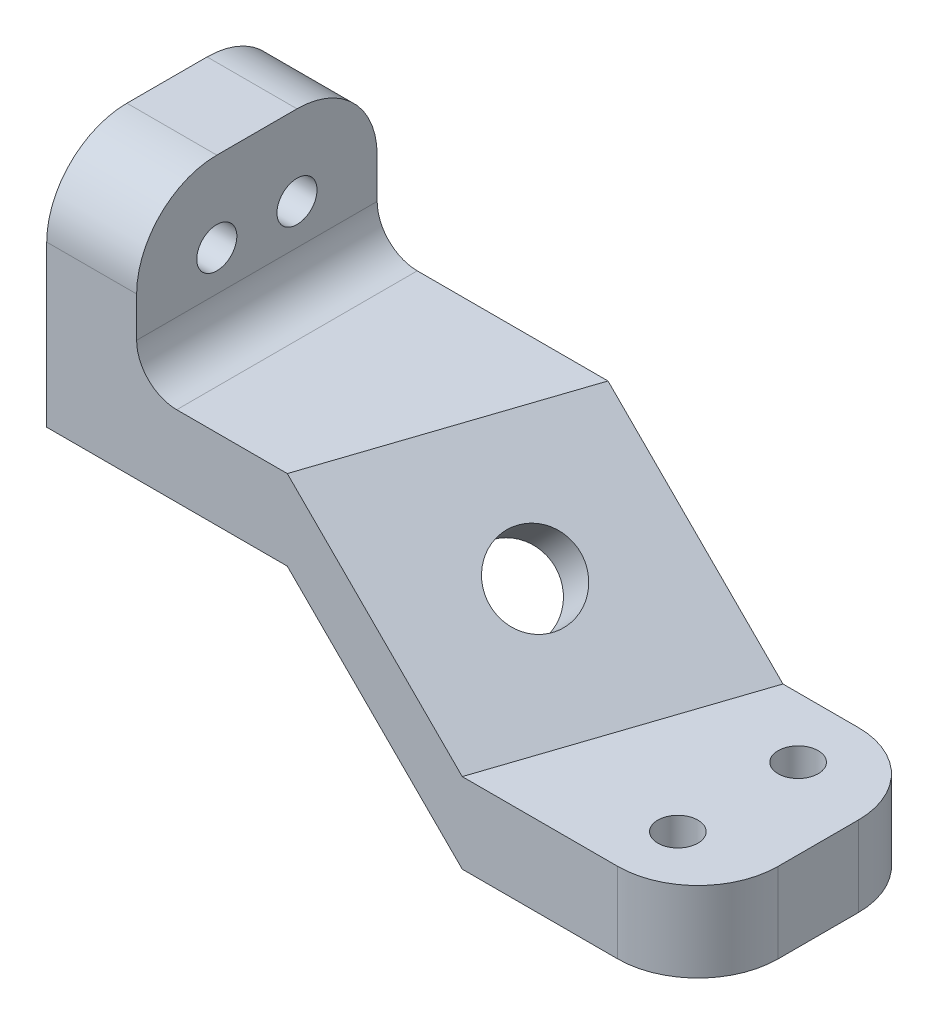
ISO-10303-21;
HEADER;
FILE_DESCRIPTION(('STEP AP214'),'2;1');
FILE_NAME('part.step','',(''),(''),'','','');
FILE_SCHEMA(('AUTOMOTIVE_DESIGN { 1 0 10303 214 1 1 1 1 }'));
ENDSEC;
DATA;
#1=APPLICATION_CONTEXT('core data for automotive mechanical design processes');
#2=APPLICATION_PROTOCOL_DEFINITION('international standard','automotive_design',2000,#1);
#3=PRODUCT_CONTEXT('',#1,'mechanical');
#4=PRODUCT('Part','Part','',(#3));
#5=PRODUCT_RELATED_PRODUCT_CATEGORY('part','',(#4));
#6=PRODUCT_DEFINITION_FORMATION('','',#4);
#7=PRODUCT_DEFINITION_CONTEXT('part definition',#1,'design');
#8=PRODUCT_DEFINITION('design','',#6,#7);
#9=PRODUCT_DEFINITION_SHAPE('','',#8);
#10=(LENGTH_UNIT() NAMED_UNIT(*) SI_UNIT(.MILLI.,.METRE.));
#11=(NAMED_UNIT(*) PLANE_ANGLE_UNIT() SI_UNIT($,.RADIAN.));
#12=(NAMED_UNIT(*) SI_UNIT($,.STERADIAN.) SOLID_ANGLE_UNIT());
#13=UNCERTAINTY_MEASURE_WITH_UNIT(LENGTH_MEASURE(1.E-05),#10,'distance_accuracy_value','');
#14=(GEOMETRIC_REPRESENTATION_CONTEXT(3) GLOBAL_UNCERTAINTY_ASSIGNED_CONTEXT((#13)) GLOBAL_UNIT_ASSIGNED_CONTEXT((#10,
#11,#12)) REPRESENTATION_CONTEXT('',''));
#15=CARTESIAN_POINT('',(0.,0.,0.));
#16=DIRECTION('',(0.,0.,1.));
#17=DIRECTION('',(1.,0.,0.));
#18=AXIS2_PLACEMENT_3D('',#15,#16,#17);
#19=CARTESIAN_POINT('',(1.1211728134124,3.,0.));
#20=DIRECTION('',(1.,0.,0.));
#21=DIRECTION('',(0.,0.,-1.));
#22=AXIS2_PLACEMENT_3D('',#19,#20,#21);
#23=PLANE('',#22);
#24=DIRECTION('',(0.,-1.,0.));
#25=VECTOR('',#24,1.);
#26=CARTESIAN_POINT('',(1.1211728134124,3.,3.));
#27=LINE('',#26,#25);
#28=CARTESIAN_POINT('',(1.1211728134124,2.,3.));
#29=VERTEX_POINT('',#28);
#30=CARTESIAN_POINT('',(1.1211728134124,1.5,3.));
#31=VERTEX_POINT('',#30);
#32=EDGE_CURVE('E234',#29,#31,#27,.T.);
#33=ORIENTED_EDGE('',*,*,#32,.T.);
#34=DIRECTION('',(0.,0.,-1.));
#35=VECTOR('',#34,1.);
#36=CARTESIAN_POINT('',(1.1211728134124,1.5,0.));
#37=LINE('',#36,#35);
#38=CARTESIAN_POINT('',(1.1211728134124,1.5,0.));
#39=VERTEX_POINT('',#38);
#40=EDGE_CURVE('E287',#31,#39,#37,.T.);
#41=ORIENTED_EDGE('',*,*,#40,.T.);
#42=DIRECTION('',(0.,-1.,0.));
#43=VECTOR('',#42,1.);
#44=CARTESIAN_POINT('',(1.1211728134124,3.,0.));
#45=LINE('',#44,#43);
#46=CARTESIAN_POINT('',(1.1211728134124,2.,0.));
#47=VERTEX_POINT('',#46);
#48=EDGE_CURVE('E248',#47,#39,#45,.T.);
#49=ORIENTED_EDGE('',*,*,#48,.F.);
#50=CARTESIAN_POINT('',(1.1211728134124,2.,1.));
#51=DIRECTION('',(1.,0.,0.));
#52=DIRECTION('',(0.,0.,-1.));
#53=AXIS2_PLACEMENT_3D('',#50,#51,#52);
#54=CIRCLE('',#53,1.);
#55=CARTESIAN_POINT('',(1.1211728134124,3.,1.));
#56=VERTEX_POINT('',#55);
#57=EDGE_CURVE('E255',#47,#56,#54,.T.);
#58=ORIENTED_EDGE('',*,*,#57,.T.);
#59=DIRECTION('',(0.,0.,1.));
#60=VECTOR('',#59,1.);
#61=CARTESIAN_POINT('',(1.1211728134124,3.,0.));
#62=LINE('',#61,#60);
#63=CARTESIAN_POINT('',(1.1211728134124,3.,2.));
#64=VERTEX_POINT('',#63);
#65=EDGE_CURVE('E227',#56,#64,#62,.T.);
#66=ORIENTED_EDGE('',*,*,#65,.T.);
#67=CARTESIAN_POINT('',(1.1211728134124,2.,2.));
#68=DIRECTION('',(1.,0.,0.));
#69=DIRECTION('',(0.,0.,-1.));
#70=AXIS2_PLACEMENT_3D('',#67,#68,#69);
#71=CIRCLE('',#70,1.);
#72=EDGE_CURVE('E253',#64,#29,#71,.T.);
#73=ORIENTED_EDGE('',*,*,#72,.T.);
#74=EDGE_LOOP('',(#33,#41,#49,#58,#66,#73));
#75=FACE_BOUND('',#74,.T.);
#76=CARTESIAN_POINT('',(1.1211728134124,2.,2.));
#77=DIRECTION('',(1.,0.,0.));
#78=DIRECTION('',(0.,0.,-1.));
#79=AXIS2_PLACEMENT_3D('',#76,#77,#78);
#80=CIRCLE('',#79,0.25);
#81=CARTESIAN_POINT('',(1.1211728134124,2.,1.75));
#82=VERTEX_POINT('',#81);
#83=EDGE_CURVE('E215',#82,#82,#80,.T.);
#84=ORIENTED_EDGE('',*,*,#83,.F.);
#85=EDGE_LOOP('',(#84));
#86=FACE_BOUND('',#85,.T.);
#87=CARTESIAN_POINT('',(1.1211728134124,2.,1.));
#88=DIRECTION('',(1.,0.,0.));
#89=DIRECTION('',(0.,0.,-1.));
#90=AXIS2_PLACEMENT_3D('',#87,#88,#89);
#91=CIRCLE('',#90,0.25);
#92=CARTESIAN_POINT('',(1.1211728134124,2.,0.75));
#93=VERTEX_POINT('',#92);
#94=EDGE_CURVE('E220',#93,#93,#91,.F.);
#95=ORIENTED_EDGE('',*,*,#94,.T.);
#96=EDGE_LOOP('',(#95));
#97=FACE_BOUND('',#96,.T.);
#98=ADVANCED_FACE('F55',(#75,#86,#97),#23,.T.);
#99=CARTESIAN_POINT('',(0.,3.,0.));
#100=DIRECTION('',(1.,0.,0.));
#101=DIRECTION('',(0.,0.,-1.));
#102=AXIS2_PLACEMENT_3D('',#99,#100,#101);
#103=PLANE('',#102);
#104=CARTESIAN_POINT('',(0.,2.,2.));
#105=DIRECTION('',(1.,0.,0.));
#106=DIRECTION('',(0.,0.,-1.));
#107=AXIS2_PLACEMENT_3D('',#104,#105,#106);
#108=CIRCLE('',#107,0.25);
#109=CARTESIAN_POINT('',(0.,2.,1.75));
#110=VERTEX_POINT('',#109);
#111=EDGE_CURVE('E211',#110,#110,#108,.T.);
#112=ORIENTED_EDGE('',*,*,#111,.T.);
#113=EDGE_LOOP('',(#112));
#114=FACE_BOUND('',#113,.T.);
#115=DIRECTION('',(0.,0.,1.));
#116=VECTOR('',#115,1.);
#117=CARTESIAN_POINT('',(0.,3.,0.));
#118=LINE('',#117,#116);
#119=CARTESIAN_POINT('',(0.,3.,1.));
#120=VERTEX_POINT('',#119);
#121=CARTESIAN_POINT('',(0.,3.,2.));
#122=VERTEX_POINT('',#121);
#123=EDGE_CURVE('E230',#120,#122,#118,.T.);
#124=ORIENTED_EDGE('',*,*,#123,.F.);
#125=CARTESIAN_POINT('',(0.,2.,1.));
#126=DIRECTION('',(1.,0.,0.));
#127=DIRECTION('',(0.,0.,-1.));
#128=AXIS2_PLACEMENT_3D('',#125,#126,#127);
#129=CIRCLE('',#128,1.);
#130=CARTESIAN_POINT('',(0.,2.,0.));
#131=VERTEX_POINT('',#130);
#132=EDGE_CURVE('E264',#120,#131,#129,.F.);
#133=ORIENTED_EDGE('',*,*,#132,.T.);
#134=DIRECTION('',(0.,-1.,0.));
#135=VECTOR('',#134,1.);
#136=CARTESIAN_POINT('',(0.,3.,0.));
#137=LINE('',#136,#135);
#138=CARTESIAN_POINT('',(0.,0.,0.));
#139=VERTEX_POINT('',#138);
#140=EDGE_CURVE('E246',#131,#139,#137,.T.);
#141=ORIENTED_EDGE('',*,*,#140,.T.);
#142=DIRECTION('',(0.,0.,1.));
#143=VECTOR('',#142,1.);
#144=CARTESIAN_POINT('',(0.,0.,0.));
#145=LINE('',#144,#143);
#146=CARTESIAN_POINT('',(0.,0.,3.));
#147=VERTEX_POINT('',#146);
#148=EDGE_CURVE('E237',#139,#147,#145,.T.);
#149=ORIENTED_EDGE('',*,*,#148,.T.);
#150=DIRECTION('',(0.,-1.,0.));
#151=VECTOR('',#150,1.);
#152=CARTESIAN_POINT('',(0.,3.,3.));
#153=LINE('',#152,#151);
#154=CARTESIAN_POINT('',(0.,2.,3.));
#155=VERTEX_POINT('',#154);
#156=EDGE_CURVE('E244',#155,#147,#153,.T.);
#157=ORIENTED_EDGE('',*,*,#156,.F.);
#158=CARTESIAN_POINT('',(0.,2.,2.));
#159=DIRECTION('',(1.,0.,0.));
#160=DIRECTION('',(0.,0.,-1.));
#161=AXIS2_PLACEMENT_3D('',#158,#159,#160);
#162=CIRCLE('',#161,1.);
#163=EDGE_CURVE('E262',#155,#122,#162,.F.);
#164=ORIENTED_EDGE('',*,*,#163,.T.);
#165=EDGE_LOOP('',(#124,#133,#141,#149,#157,#164));
#166=FACE_BOUND('',#165,.T.);
#167=CARTESIAN_POINT('',(0.,2.,1.));
#168=DIRECTION('',(1.,0.,0.));
#169=DIRECTION('',(0.,0.,-1.));
#170=AXIS2_PLACEMENT_3D('',#167,#168,#169);
#171=CIRCLE('',#170,0.25);
#172=CARTESIAN_POINT('',(0.,2.,0.75));
#173=VERTEX_POINT('',#172);
#174=EDGE_CURVE('E212',#173,#173,#171,.F.);
#175=ORIENTED_EDGE('',*,*,#174,.F.);
#176=EDGE_LOOP('',(#175));
#177=FACE_BOUND('',#176,.T.);
#178=ADVANCED_FACE('F329',(#114,#166,#177),#103,.F.);
#179=CARTESIAN_POINT('',(0.,3.,0.));
#180=DIRECTION('',(0.,0.,-1.));
#181=DIRECTION('',(-1.,0.,0.));
#182=AXIS2_PLACEMENT_3D('',#179,#180,#181);
#183=PLANE('',#182);
#184=DIRECTION('',(1.,0.,0.));
#185=VECTOR('',#184,1.);
#186=CARTESIAN_POINT('',(-0.00200000000000027,-1.18201193389238,0.));
#187=LINE('',#186,#185);
#188=CARTESIAN_POINT('',(6.18201193389238,-1.18201193389238,0.));
#189=VERTEX_POINT('',#188);
#190=CARTESIAN_POINT('',(7.1211728134124,-1.18201193389238,0.));
#191=VERTEX_POINT('',#190);
#192=EDGE_CURVE('E164',#189,#191,#187,.T.);
#193=ORIENTED_EDGE('',*,*,#192,.T.);
#194=DIRECTION('',(0.,1.,0.));
#195=VECTOR('',#194,1.);
#196=CARTESIAN_POINT('',(7.1211728134124,3.,0.));
#197=LINE('',#196,#195);
#198=CARTESIAN_POINT('',(7.1211728134124,-2.18201193389238,0.));
#199=VERTEX_POINT('',#198);
#200=EDGE_CURVE('E279',#191,#199,#197,.F.);
#201=ORIENTED_EDGE('',*,*,#200,.T.);
#202=DIRECTION('',(1.,0.,0.));
#203=VECTOR('',#202,1.);
#204=CARTESIAN_POINT('',(-0.00200000000000027,-2.18201193389238,0.));
#205=LINE('',#204,#203);
#206=CARTESIAN_POINT('',(6.18201193389238,-2.18201193389238,0.));
#207=VERTEX_POINT('',#206);
#208=EDGE_CURVE('E196',#207,#199,#205,.T.);
#209=ORIENTED_EDGE('',*,*,#208,.F.);
#210=DIRECTION('',(0.707106781186548,-0.707106781186547,0.));
#211=VECTOR('',#210,1.);
#212=CARTESIAN_POINT('',(4.,0.,0.));
#213=LINE('',#212,#211);
#214=CARTESIAN_POINT('',(4.,0.,0.));
#215=VERTEX_POINT('',#214);
#216=EDGE_CURVE('E207',#215,#207,#213,.T.);
#217=ORIENTED_EDGE('',*,*,#216,.F.);
#218=DIRECTION('',(1.,0.,0.));
#219=VECTOR('',#218,1.);
#220=CARTESIAN_POINT('',(0.,0.,0.));
#221=LINE('',#220,#219);
#222=EDGE_CURVE('E225',#139,#215,#221,.T.);
#223=ORIENTED_EDGE('',*,*,#222,.F.);
#224=ORIENTED_EDGE('',*,*,#140,.F.);
#225=DIRECTION('',(1.,0.,0.));
#226=VECTOR('',#225,1.);
#227=CARTESIAN_POINT('',(0.,2.,0.));
#228=LINE('',#227,#226);
#229=EDGE_CURVE('E250',#131,#47,#228,.T.);
#230=ORIENTED_EDGE('',*,*,#229,.T.);
#231=ORIENTED_EDGE('',*,*,#48,.T.);
#232=CARTESIAN_POINT('',(1.6211728134124,1.5,0.));
#233=DIRECTION('',(0.,0.,-1.));
#234=DIRECTION('',(-1.,0.,0.));
#235=AXIS2_PLACEMENT_3D('',#232,#233,#234);
#236=CIRCLE('',#235,0.5);
#237=CARTESIAN_POINT('',(1.6211728134124,1.,0.));
#238=VERTEX_POINT('',#237);
#239=EDGE_CURVE('E63',#39,#238,#236,.F.);
#240=ORIENTED_EDGE('',*,*,#239,.T.);
#241=DIRECTION('',(-1.,0.,0.));
#242=VECTOR('',#241,1.);
#243=CARTESIAN_POINT('',(0.,1.,0.));
#244=LINE('',#243,#242);
#245=CARTESIAN_POINT('',(4.,1.,0.));
#246=VERTEX_POINT('',#245);
#247=EDGE_CURVE('E166',#246,#238,#244,.T.);
#248=ORIENTED_EDGE('',*,*,#247,.F.);
#249=DIRECTION('',(0.707106781186548,-0.707106781186547,0.));
#250=VECTOR('',#249,1.);
#251=CARTESIAN_POINT('',(4.,1.,0.));
#252=LINE('',#251,#250);
#253=EDGE_CURVE('E160',#246,#189,#252,.T.);
#254=ORIENTED_EDGE('',*,*,#253,.T.);
#255=EDGE_LOOP('',(#193,#201,#209,#217,#223,#224,#230,#231,#240,#248,#254));
#256=FACE_BOUND('',#255,.T.);
#257=ADVANCED_FACE('F162',(#256),#183,.T.);
#258=CARTESIAN_POINT('',(0.,3.,3.));
#259=DIRECTION('',(0.,0.,-1.));
#260=DIRECTION('',(-1.,0.,0.));
#261=AXIS2_PLACEMENT_3D('',#258,#259,#260);
#262=PLANE('',#261);
#263=DIRECTION('',(1.,0.,0.));
#264=VECTOR('',#263,1.);
#265=CARTESIAN_POINT('',(-0.00200000000000027,-2.18201193389238,3.));
#266=LINE('',#265,#264);
#267=CARTESIAN_POINT('',(5.18229983645101,-2.18201193389238,3.));
#268=VERTEX_POINT('',#267);
#269=CARTESIAN_POINT('',(7.1211728134124,-2.18201193389238,3.));
#270=VERTEX_POINT('',#269);
#271=EDGE_CURVE('E186',#268,#270,#266,.T.);
#272=ORIENTED_EDGE('',*,*,#271,.T.);
#273=DIRECTION('',(0.,-1.,0.));
#274=VECTOR('',#273,1.);
#275=CARTESIAN_POINT('',(7.1211728134124,-1.18201193389238,3.));
#276=LINE('',#275,#274);
#277=CARTESIAN_POINT('',(7.1211728134124,-1.18201193389238,3.));
#278=VERTEX_POINT('',#277);
#279=EDGE_CURVE('E285',#270,#278,#276,.F.);
#280=ORIENTED_EDGE('',*,*,#279,.T.);
#281=DIRECTION('',(1.,0.,0.));
#282=VECTOR('',#281,1.);
#283=CARTESIAN_POINT('',(-0.00200000000000027,-1.18201193389238,3.));
#284=LINE('',#283,#282);
#285=CARTESIAN_POINT('',(5.18229983645101,-1.18201193389238,3.));
#286=VERTEX_POINT('',#285);
#287=EDGE_CURVE('E183',#286,#278,#284,.T.);
#288=ORIENTED_EDGE('',*,*,#287,.F.);
#289=DIRECTION('',(0.707106781186548,-0.707106781186547,0.));
#290=VECTOR('',#289,1.);
#291=CARTESIAN_POINT('',(3.00028790255863,1.,3.));
#292=LINE('',#291,#290);
#293=CARTESIAN_POINT('',(3.00028790255863,1.,3.));
#294=VERTEX_POINT('',#293);
#295=EDGE_CURVE('E175',#294,#286,#292,.T.);
#296=ORIENTED_EDGE('',*,*,#295,.F.);
#297=DIRECTION('',(-1.,0.,0.));
#298=VECTOR('',#297,1.);
#299=CARTESIAN_POINT('',(0.,1.,3.));
#300=LINE('',#299,#298);
#301=CARTESIAN_POINT('',(1.6211728134124,1.,3.));
#302=VERTEX_POINT('',#301);
#303=EDGE_CURVE('E223',#294,#302,#300,.T.);
#304=ORIENTED_EDGE('',*,*,#303,.T.);
#305=CARTESIAN_POINT('',(1.6211728134124,1.5,3.));
#306=DIRECTION('',(0.,0.,-1.));
#307=DIRECTION('',(-1.,0.,0.));
#308=AXIS2_PLACEMENT_3D('',#305,#306,#307);
#309=CIRCLE('',#308,0.5);
#310=EDGE_CURVE('E12',#302,#31,#309,.T.);
#311=ORIENTED_EDGE('',*,*,#310,.T.);
#312=ORIENTED_EDGE('',*,*,#32,.F.);
#313=DIRECTION('',(1.,0.,0.));
#314=VECTOR('',#313,1.);
#315=CARTESIAN_POINT('',(0.,2.,3.));
#316=LINE('',#315,#314);
#317=EDGE_CURVE('E266',#29,#155,#316,.F.);
#318=ORIENTED_EDGE('',*,*,#317,.T.);
#319=ORIENTED_EDGE('',*,*,#156,.T.);
#320=DIRECTION('',(1.,0.,0.));
#321=VECTOR('',#320,1.);
#322=CARTESIAN_POINT('',(0.,0.,3.));
#323=LINE('',#322,#321);
#324=CARTESIAN_POINT('',(3.00028790255863,0.,3.));
#325=VERTEX_POINT('',#324);
#326=EDGE_CURVE('E231',#147,#325,#323,.T.);
#327=ORIENTED_EDGE('',*,*,#326,.T.);
#328=DIRECTION('',(0.707106781186548,-0.707106781186547,0.));
#329=VECTOR('',#328,1.);
#330=CARTESIAN_POINT('',(3.00028790255863,0.,3.));
#331=LINE('',#330,#329);
#332=EDGE_CURVE('E200',#325,#268,#331,.T.);
#333=ORIENTED_EDGE('',*,*,#332,.T.);
#334=EDGE_LOOP('',(#272,#280,#288,#296,#304,#311,#312,#318,#319,#327,#333));
#335=FACE_BOUND('',#334,.T.);
#336=ADVANCED_FACE('F318',(#335),#262,.F.);
#337=CARTESIAN_POINT('',(0.,3.,0.));
#338=DIRECTION('',(0.,1.,0.));
#339=DIRECTION('',(0.,0.,1.));
#340=AXIS2_PLACEMENT_3D('',#337,#338,#339);
#341=PLANE('',#340);
#342=ORIENTED_EDGE('',*,*,#65,.F.);
#343=DIRECTION('',(1.,0.,0.));
#344=VECTOR('',#343,1.);
#345=CARTESIAN_POINT('',(0.,3.,1.));
#346=LINE('',#345,#344);
#347=EDGE_CURVE('E260',#56,#120,#346,.F.);
#348=ORIENTED_EDGE('',*,*,#347,.T.);
#349=ORIENTED_EDGE('',*,*,#123,.T.);
#350=DIRECTION('',(1.,0.,0.));
#351=VECTOR('',#350,1.);
#352=CARTESIAN_POINT('',(1.1211728134124,3.,2.));
#353=LINE('',#352,#351);
#354=EDGE_CURVE('E257',#122,#64,#353,.T.);
#355=ORIENTED_EDGE('',*,*,#354,.T.);
#356=EDGE_LOOP('',(#342,#348,#349,#355));
#357=FACE_BOUND('',#356,.T.);
#358=ADVANCED_FACE('F310',(#357),#341,.T.);
#359=CARTESIAN_POINT('',(0.,0.,0.));
#360=DIRECTION('',(0.,1.,0.));
#361=DIRECTION('',(0.,0.,1.));
#362=AXIS2_PLACEMENT_3D('',#359,#360,#361);
#363=PLANE('',#362);
#364=ORIENTED_EDGE('',*,*,#222,.T.);
#365=DIRECTION('',(0.316145823973809,0.,-0.948710608132913));
#366=VECTOR('',#365,1.);
#367=CARTESIAN_POINT('',(4.,0.,0.));
#368=LINE('',#367,#366);
#369=EDGE_CURVE('E209',#325,#215,#368,.T.);
#370=ORIENTED_EDGE('',*,*,#369,.F.);
#371=ORIENTED_EDGE('',*,*,#326,.F.);
#372=ORIENTED_EDGE('',*,*,#148,.F.);
#373=EDGE_LOOP('',(#364,#370,#371,#372));
#374=FACE_BOUND('',#373,.T.);
#375=ADVANCED_FACE('F456',(#374),#363,.F.);
#376=CARTESIAN_POINT('',(0.,1.,3.));
#377=DIRECTION('',(0.,-1.,0.));
#378=DIRECTION('',(0.,0.,-1.));
#379=AXIS2_PLACEMENT_3D('',#376,#377,#378);
#380=PLANE('',#379);
#381=ORIENTED_EDGE('',*,*,#247,.T.);
#382=DIRECTION('',(0.,0.,-1.));
#383=VECTOR('',#382,1.);
#384=CARTESIAN_POINT('',(1.6211728134124,1.,3.));
#385=LINE('',#384,#383);
#386=EDGE_CURVE('E76',#238,#302,#385,.F.);
#387=ORIENTED_EDGE('',*,*,#386,.T.);
#388=ORIENTED_EDGE('',*,*,#303,.F.);
#389=DIRECTION('',(0.31614582397381,0.,-0.948710608132913));
#390=VECTOR('',#389,1.);
#391=CARTESIAN_POINT('',(2.70041458117306,1.,3.89987904163526));
#392=LINE('',#391,#390);
#393=EDGE_CURVE('E268',#294,#246,#392,.T.);
#394=ORIENTED_EDGE('',*,*,#393,.T.);
#395=EDGE_LOOP('',(#381,#387,#388,#394));
#396=FACE_BOUND('',#395,.T.);
#397=ADVANCED_FACE('F340',(#396),#380,.F.);
#398=CARTESIAN_POINT('',(0.,2.,1.));
#399=DIRECTION('',(1.,0.,0.));
#400=DIRECTION('',(0.,0.,-1.));
#401=AXIS2_PLACEMENT_3D('',#398,#399,#400);
#402=CYLINDRICAL_SURFACE('',#401,1.);
#403=ORIENTED_EDGE('',*,*,#132,.F.);
#404=ORIENTED_EDGE('',*,*,#347,.F.);
#405=ORIENTED_EDGE('',*,*,#57,.F.);
#406=ORIENTED_EDGE('',*,*,#229,.F.);
#407=EDGE_LOOP('',(#403,#404,#405,#406));
#408=FACE_BOUND('',#407,.T.);
#409=ADVANCED_FACE('F306',(#408),#402,.T.);
#410=CARTESIAN_POINT('',(0.,2.,2.));
#411=DIRECTION('',(-1.,0.,0.));
#412=DIRECTION('',(0.,0.,1.));
#413=AXIS2_PLACEMENT_3D('',#410,#411,#412);
#414=CYLINDRICAL_SURFACE('',#413,1.);
#415=ORIENTED_EDGE('',*,*,#163,.F.);
#416=ORIENTED_EDGE('',*,*,#317,.F.);
#417=ORIENTED_EDGE('',*,*,#72,.F.);
#418=ORIENTED_EDGE('',*,*,#354,.F.);
#419=EDGE_LOOP('',(#415,#416,#417,#418));
#420=FACE_BOUND('',#419,.T.);
#421=ADVANCED_FACE('F315',(#420),#414,.T.);
#422=CARTESIAN_POINT('',(0.,2.,2.));
#423=DIRECTION('',(1.,0.,0.));
#424=DIRECTION('',(0.,0.,-1.));
#425=AXIS2_PLACEMENT_3D('',#422,#423,#424);
#426=CYLINDRICAL_SURFACE('',#425,0.25);
#427=ORIENTED_EDGE('',*,*,#83,.T.);
#428=EDGE_LOOP('',(#427));
#429=FACE_BOUND('',#428,.T.);
#430=ORIENTED_EDGE('',*,*,#111,.F.);
#431=EDGE_LOOP('',(#430));
#432=FACE_BOUND('',#431,.T.);
#433=ADVANCED_FACE('F343',(#429,#432),#426,.F.);
#434=CARTESIAN_POINT('',(0.,2.,1.));
#435=DIRECTION('',(1.,0.,0.));
#436=DIRECTION('',(0.,0.,-1.));
#437=AXIS2_PLACEMENT_3D('',#434,#435,#436);
#438=CYLINDRICAL_SURFACE('',#437,0.25);
#439=ORIENTED_EDGE('',*,*,#94,.F.);
#440=EDGE_LOOP('',(#439));
#441=FACE_BOUND('',#440,.T.);
#442=ORIENTED_EDGE('',*,*,#174,.T.);
#443=EDGE_LOOP('',(#442));
#444=FACE_BOUND('',#443,.T.);
#445=ADVANCED_FACE('F381',(#441,#444),#438,.F.);
#446=CARTESIAN_POINT('',(4.,1.,0.));
#447=DIRECTION('',(0.68825762919638,0.68825762919638,0.229353159354645));
#448=DIRECTION('',(-0.707106781186547,0.707106781186547,0.));
#449=AXIS2_PLACEMENT_3D('',#446,#447,#448);
#450=PLANE('',#449);
#451=CARTESIAN_POINT('',(4.59114991822551,-0.0910059669461893,1.5));
#452=DIRECTION('',(0.68825762919638,0.68825762919638,0.229353159354645));
#453=DIRECTION('',(-0.707106781186547,0.707106781186547,0.));
#454=AXIS2_PLACEMENT_3D('',#451,#452,#453);
#455=CIRCLE('',#454,0.5);
#456=CARTESIAN_POINT('',(4.23759652763223,0.262547423647085,1.5));
#457=VERTEX_POINT('',#456);
#458=EDGE_CURVE('E291',#457,#457,#455,.T.);
#459=ORIENTED_EDGE('',*,*,#458,.F.);
#460=EDGE_LOOP('',(#459));
#461=FACE_BOUND('',#460,.T.);
#462=ORIENTED_EDGE('',*,*,#295,.T.);
#463=DIRECTION('',(-0.31614582397381,0.,0.948710608132913));
#464=VECTOR('',#463,1.);
#465=CARTESIAN_POINT('',(6.18201193389238,-1.18201193389238,0.));
#466=LINE('',#465,#464);
#467=EDGE_CURVE('E169',#189,#286,#466,.T.);
#468=ORIENTED_EDGE('',*,*,#467,.F.);
#469=ORIENTED_EDGE('',*,*,#253,.F.);
#470=ORIENTED_EDGE('',*,*,#393,.F.);
#471=EDGE_LOOP('',(#462,#468,#469,#470));
#472=FACE_BOUND('',#471,.T.);
#473=ADVANCED_FACE('F173',(#461,#472),#450,.T.);
#474=CARTESIAN_POINT('',(3.00028790255863,0.,3.));
#475=DIRECTION('',(-0.68825762919638,-0.68825762919638,-0.229353159354645));
#476=DIRECTION('',(0.707106781186547,-0.707106781186547,0.));
#477=AXIS2_PLACEMENT_3D('',#474,#475,#476);
#478=PLANE('',#477);
#479=CARTESIAN_POINT('',(4.11745135407849,-0.56470453109321,1.34214593829387));
#480=DIRECTION('',(-0.68825762919638,-0.68825762919638,-0.229353159354645));
#481=DIRECTION('',(0.707106781186547,-0.707106781186547,0.));
#482=AXIS2_PLACEMENT_3D('',#479,#480,#481);
#483=CIRCLE('',#482,0.5);
#484=CARTESIAN_POINT('',(4.47100474467176,-0.918257921686484,1.34214593829387));
#485=VERTEX_POINT('',#484);
#486=EDGE_CURVE('E288',#485,#485,#483,.T.);
#487=ORIENTED_EDGE('',*,*,#486,.F.);
#488=EDGE_LOOP('',(#487));
#489=FACE_BOUND('',#488,.T.);
#490=ORIENTED_EDGE('',*,*,#216,.T.);
#491=DIRECTION('',(0.31614582397381,0.,-0.948710608132913));
#492=VECTOR('',#491,1.);
#493=CARTESIAN_POINT('',(5.18229983645101,-2.18201193389238,3.));
#494=LINE('',#493,#492);
#495=EDGE_CURVE('E204',#268,#207,#494,.T.);
#496=ORIENTED_EDGE('',*,*,#495,.F.);
#497=ORIENTED_EDGE('',*,*,#332,.F.);
#498=ORIENTED_EDGE('',*,*,#369,.T.);
#499=EDGE_LOOP('',(#490,#496,#497,#498));
#500=FACE_BOUND('',#499,.T.);
#501=ADVANCED_FACE('F380',(#489,#500),#478,.T.);
#502=CARTESIAN_POINT('',(-0.00200000000000027,-1.18201193389238,0.));
#503=DIRECTION('',(0.,1.,0.));
#504=DIRECTION('',(0.,0.,1.));
#505=AXIS2_PLACEMENT_3D('',#502,#503,#504);
#506=PLANE('',#505);
#507=CARTESIAN_POINT('',(7.1211728134124,-1.18201193389238,2.25));
#508=DIRECTION('',(0.,1.,0.));
#509=DIRECTION('',(0.,0.,1.));
#510=AXIS2_PLACEMENT_3D('',#507,#508,#509);
#511=CIRCLE('',#510,0.250000000000006);
#512=CARTESIAN_POINT('',(7.1211728134124,-1.18201193389238,2.50000000000001));
#513=VERTEX_POINT('',#512);
#514=EDGE_CURVE('E189',#513,#513,#511,.T.);
#515=ORIENTED_EDGE('',*,*,#514,.F.);
#516=EDGE_LOOP('',(#515));
#517=FACE_BOUND('',#516,.T.);
#518=CARTESIAN_POINT('',(7.1211728134124,-1.18201193389238,0.75));
#519=DIRECTION('',(0.,1.,0.));
#520=DIRECTION('',(0.,0.,-1.));
#521=AXIS2_PLACEMENT_3D('',#518,#519,#520);
#522=CIRCLE('',#521,0.25);
#523=CARTESIAN_POINT('',(7.1211728134124,-1.18201193389238,0.499999999999999));
#524=VERTEX_POINT('',#523);
#525=EDGE_CURVE('E367',#524,#524,#522,.T.);
#526=ORIENTED_EDGE('',*,*,#525,.F.);
#527=EDGE_LOOP('',(#526));
#528=FACE_BOUND('',#527,.T.);
#529=DIRECTION('',(0.,0.,1.));
#530=VECTOR('',#529,1.);
#531=CARTESIAN_POINT('',(8.1211728134124,-1.18201193389238,0.));
#532=LINE('',#531,#530);
#533=CARTESIAN_POINT('',(8.1211728134124,-1.18201193389238,1.));
#534=VERTEX_POINT('',#533);
#535=CARTESIAN_POINT('',(8.1211728134124,-1.18201193389238,2.));
#536=VERTEX_POINT('',#535);
#537=EDGE_CURVE('E170',#534,#536,#532,.T.);
#538=ORIENTED_EDGE('',*,*,#537,.F.);
#539=CARTESIAN_POINT('',(7.1211728134124,-1.18201193389238,1.));
#540=DIRECTION('',(0.,1.,0.));
#541=DIRECTION('',(0.,0.,1.));
#542=AXIS2_PLACEMENT_3D('',#539,#540,#541);
#543=CIRCLE('',#542,1.);
#544=EDGE_CURVE('E182',#534,#191,#543,.T.);
#545=ORIENTED_EDGE('',*,*,#544,.T.);
#546=ORIENTED_EDGE('',*,*,#192,.F.);
#547=ORIENTED_EDGE('',*,*,#467,.T.);
#548=ORIENTED_EDGE('',*,*,#287,.T.);
#549=CARTESIAN_POINT('',(7.1211728134124,-1.18201193389238,2.));
#550=DIRECTION('',(0.,1.,0.));
#551=DIRECTION('',(0.,0.,1.));
#552=AXIS2_PLACEMENT_3D('',#549,#550,#551);
#553=CIRCLE('',#552,1.);
#554=EDGE_CURVE('E276',#278,#536,#553,.T.);
#555=ORIENTED_EDGE('',*,*,#554,.T.);
#556=EDGE_LOOP('',(#538,#545,#546,#547,#548,#555));
#557=FACE_BOUND('',#556,.T.);
#558=ADVANCED_FACE('F181',(#517,#528,#557),#506,.T.);
#559=CARTESIAN_POINT('',(8.1211728134124,0.,0.));
#560=DIRECTION('',(1.,0.,0.));
#561=DIRECTION('',(0.,0.,-1.));
#562=AXIS2_PLACEMENT_3D('',#559,#560,#561);
#563=PLANE('',#562);
#564=DIRECTION('',(0.,0.,-1.));
#565=VECTOR('',#564,1.);
#566=CARTESIAN_POINT('',(8.1211728134124,-2.18201193389238,0.));
#567=LINE('',#566,#565);
#568=CARTESIAN_POINT('',(8.1211728134124,-2.18201193389238,2.));
#569=VERTEX_POINT('',#568);
#570=CARTESIAN_POINT('',(8.1211728134124,-2.18201193389238,1.));
#571=VERTEX_POINT('',#570);
#572=EDGE_CURVE('E198',#569,#571,#567,.T.);
#573=ORIENTED_EDGE('',*,*,#572,.T.);
#574=DIRECTION('',(0.,1.,0.));
#575=VECTOR('',#574,1.);
#576=CARTESIAN_POINT('',(8.1211728134124,0.,1.));
#577=LINE('',#576,#575);
#578=EDGE_CURVE('E273',#571,#534,#577,.T.);
#579=ORIENTED_EDGE('',*,*,#578,.T.);
#580=ORIENTED_EDGE('',*,*,#537,.T.);
#581=DIRECTION('',(0.,-1.,0.));
#582=VECTOR('',#581,1.);
#583=CARTESIAN_POINT('',(8.1211728134124,-2.18201193389238,2.));
#584=LINE('',#583,#582);
#585=EDGE_CURVE('E270',#536,#569,#584,.T.);
#586=ORIENTED_EDGE('',*,*,#585,.T.);
#587=EDGE_LOOP('',(#573,#579,#580,#586));
#588=FACE_BOUND('',#587,.T.);
#589=ADVANCED_FACE('F363',(#588),#563,.T.);
#590=CARTESIAN_POINT('',(-0.00200000000000027,-2.18201193389238,0.));
#591=DIRECTION('',(0.,-1.,0.));
#592=DIRECTION('',(0.,0.,-1.));
#593=AXIS2_PLACEMENT_3D('',#590,#591,#592);
#594=PLANE('',#593);
#595=CARTESIAN_POINT('',(7.1211728134124,-2.18201193389238,2.25));
#596=DIRECTION('',(0.,1.,0.));
#597=DIRECTION('',(0.,0.,1.));
#598=AXIS2_PLACEMENT_3D('',#595,#596,#597);
#599=CIRCLE('',#598,0.250000000000006);
#600=CARTESIAN_POINT('',(7.1211728134124,-2.18201193389238,2.50000000000001));
#601=VERTEX_POINT('',#600);
#602=EDGE_CURVE('E184',#601,#601,#599,.T.);
#603=ORIENTED_EDGE('',*,*,#602,.T.);
#604=EDGE_LOOP('',(#603));
#605=FACE_BOUND('',#604,.T.);
#606=CARTESIAN_POINT('',(7.1211728134124,-2.18201193389238,0.75));
#607=DIRECTION('',(0.,1.,0.));
#608=DIRECTION('',(0.,0.,-1.));
#609=AXIS2_PLACEMENT_3D('',#606,#607,#608);
#610=CIRCLE('',#609,0.25);
#611=CARTESIAN_POINT('',(7.1211728134124,-2.18201193389238,0.499999999999999));
#612=VERTEX_POINT('',#611);
#613=EDGE_CURVE('E370',#612,#612,#610,.T.);
#614=ORIENTED_EDGE('',*,*,#613,.T.);
#615=EDGE_LOOP('',(#614));
#616=FACE_BOUND('',#615,.T.);
#617=ORIENTED_EDGE('',*,*,#208,.T.);
#618=CARTESIAN_POINT('',(7.1211728134124,-2.18201193389238,1.));
#619=DIRECTION('',(0.,-1.,0.));
#620=DIRECTION('',(0.,0.,-1.));
#621=AXIS2_PLACEMENT_3D('',#618,#619,#620);
#622=CIRCLE('',#621,1.);
#623=EDGE_CURVE('E283',#199,#571,#622,.T.);
#624=ORIENTED_EDGE('',*,*,#623,.T.);
#625=ORIENTED_EDGE('',*,*,#572,.F.);
#626=CARTESIAN_POINT('',(7.1211728134124,-2.18201193389238,2.));
#627=DIRECTION('',(0.,-1.,0.));
#628=DIRECTION('',(0.,0.,-1.));
#629=AXIS2_PLACEMENT_3D('',#626,#627,#628);
#630=CIRCLE('',#629,1.);
#631=EDGE_CURVE('E281',#569,#270,#630,.T.);
#632=ORIENTED_EDGE('',*,*,#631,.T.);
#633=ORIENTED_EDGE('',*,*,#271,.F.);
#634=ORIENTED_EDGE('',*,*,#495,.T.);
#635=EDGE_LOOP('',(#617,#624,#625,#632,#633,#634));
#636=FACE_BOUND('',#635,.T.);
#637=ADVANCED_FACE('F347',(#605,#616,#636),#594,.T.);
#638=CARTESIAN_POINT('',(7.1211728134124,0.,1.));
#639=DIRECTION('',(0.,1.,0.));
#640=DIRECTION('',(0.,0.,1.));
#641=AXIS2_PLACEMENT_3D('',#638,#639,#640);
#642=CYLINDRICAL_SURFACE('',#641,1.);
#643=ORIENTED_EDGE('',*,*,#623,.F.);
#644=ORIENTED_EDGE('',*,*,#200,.F.);
#645=ORIENTED_EDGE('',*,*,#544,.F.);
#646=ORIENTED_EDGE('',*,*,#578,.F.);
#647=EDGE_LOOP('',(#643,#644,#645,#646));
#648=FACE_BOUND('',#647,.T.);
#649=ADVANCED_FACE('F344',(#648),#642,.T.);
#650=CARTESIAN_POINT('',(7.1211728134124,0.,2.));
#651=DIRECTION('',(0.,1.,0.));
#652=DIRECTION('',(0.,0.,1.));
#653=AXIS2_PLACEMENT_3D('',#650,#651,#652);
#654=CYLINDRICAL_SURFACE('',#653,1.);
#655=ORIENTED_EDGE('',*,*,#554,.F.);
#656=ORIENTED_EDGE('',*,*,#279,.F.);
#657=ORIENTED_EDGE('',*,*,#631,.F.);
#658=ORIENTED_EDGE('',*,*,#585,.F.);
#659=EDGE_LOOP('',(#655,#656,#657,#658));
#660=FACE_BOUND('',#659,.T.);
#661=ADVANCED_FACE('F346',(#660),#654,.T.);
#662=CARTESIAN_POINT('',(7.1211728134124,-2.18201193389238,0.75));
#663=DIRECTION('',(0.,1.,0.));
#664=DIRECTION('',(0.,0.,1.));
#665=AXIS2_PLACEMENT_3D('',#662,#663,#664);
#666=CYLINDRICAL_SURFACE('',#665,0.25);
#667=ORIENTED_EDGE('',*,*,#613,.F.);
#668=EDGE_LOOP('',(#667));
#669=FACE_BOUND('',#668,.T.);
#670=ORIENTED_EDGE('',*,*,#525,.T.);
#671=EDGE_LOOP('',(#670));
#672=FACE_BOUND('',#671,.T.);
#673=ADVANCED_FACE('F350',(#669,#672),#666,.F.);
#674=CARTESIAN_POINT('',(7.1211728134124,-2.18201193389238,2.25));
#675=DIRECTION('',(0.,1.,0.));
#676=DIRECTION('',(0.,0.,1.));
#677=AXIS2_PLACEMENT_3D('',#674,#675,#676);
#678=CYLINDRICAL_SURFACE('',#677,0.250000000000006);
#679=ORIENTED_EDGE('',*,*,#602,.F.);
#680=EDGE_LOOP('',(#679));
#681=FACE_BOUND('',#680,.T.);
#682=ORIENTED_EDGE('',*,*,#514,.T.);
#683=EDGE_LOOP('',(#682));
#684=FACE_BOUND('',#683,.T.);
#685=ADVANCED_FACE('F325',(#681,#684),#678,.F.);
#686=CARTESIAN_POINT('',(1.18904117745391,-3.49311470771778,0.366290245013208));
#687=DIRECTION('',(0.68825762919638,0.68825762919638,0.229353159354645));
#688=DIRECTION('',(-0.707106781186547,0.707106781186547,0.));
#689=AXIS2_PLACEMENT_3D('',#686,#687,#688);
#690=CYLINDRICAL_SURFACE('',#689,0.5);
#691=ORIENTED_EDGE('',*,*,#458,.T.);
#692=EDGE_LOOP('',(#691));
#693=FACE_BOUND('',#692,.T.);
#694=ORIENTED_EDGE('',*,*,#486,.T.);
#695=EDGE_LOOP('',(#694));
#696=FACE_BOUND('',#695,.T.);
#697=ADVANCED_FACE('F321',(#693,#696),#690,.F.);
#698=CARTESIAN_POINT('',(1.6211728134124,1.5,0.));
#699=DIRECTION('',(0.,0.,-1.));
#700=DIRECTION('',(-1.,0.,0.));
#701=AXIS2_PLACEMENT_3D('',#698,#699,#700);
#702=CYLINDRICAL_SURFACE('',#701,0.5);
#703=ORIENTED_EDGE('',*,*,#310,.F.);
#704=ORIENTED_EDGE('',*,*,#386,.F.);
#705=ORIENTED_EDGE('',*,*,#239,.F.);
#706=ORIENTED_EDGE('',*,*,#40,.F.);
#707=EDGE_LOOP('',(#703,#704,#705,#706));
#708=FACE_BOUND('',#707,.T.);
#709=ADVANCED_FACE('F57',(#708),#702,.F.);
#710=CLOSED_SHELL('',(#98,#178,#257,#336,#358,#375,#397,#409,#421,#433,#445,#473,#501,#558,#589,
#637,#649,#661,#673,#685,#697,#709));
#711=MANIFOLD_SOLID_BREP('B2',#710);
#712=ADVANCED_BREP_SHAPE_REPRESENTATION('',(#18,#711),#14);
#713=SHAPE_DEFINITION_REPRESENTATION(#9,#712);
ENDSEC;
END-ISO-10303-21;
